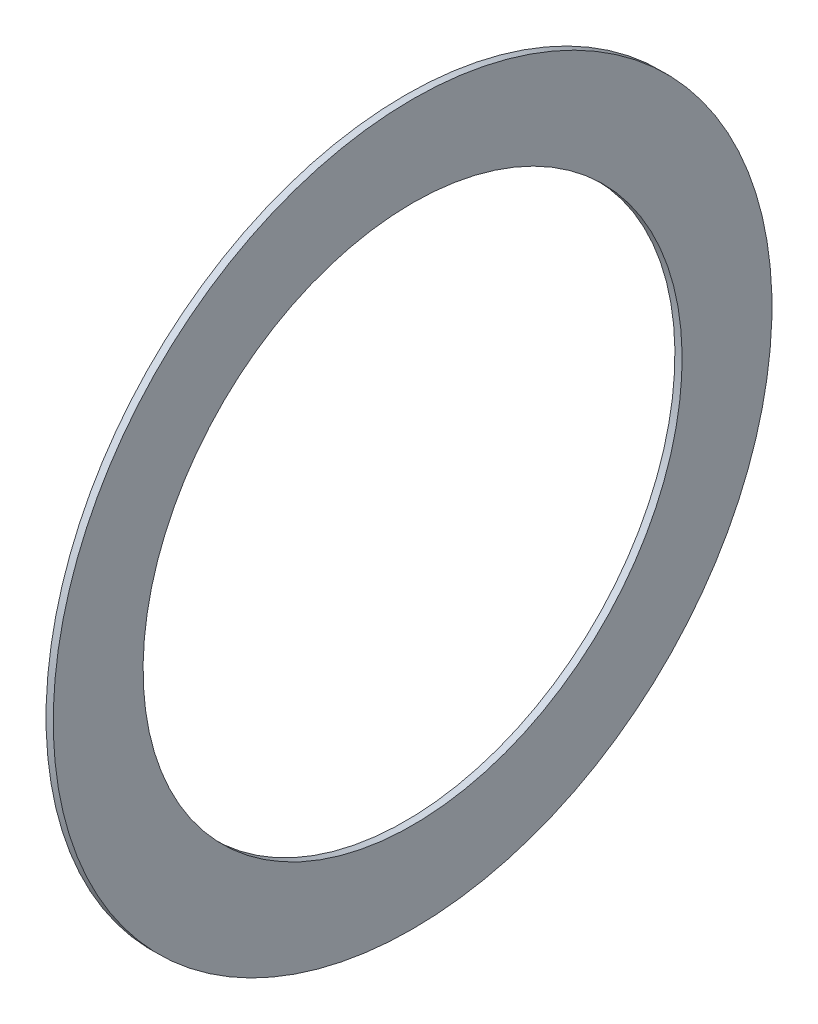
ISO-10303-21;
HEADER;
FILE_DESCRIPTION(('STEP AP214'),'2;1');
FILE_NAME('part.step','',(''),(''),'','','');
FILE_SCHEMA(('AUTOMOTIVE_DESIGN { 1 0 10303 214 1 1 1 1 }'));
ENDSEC;
DATA;
#1=APPLICATION_CONTEXT('core data for automotive mechanical design processes');
#2=APPLICATION_PROTOCOL_DEFINITION('international standard','automotive_design',2000,#1);
#3=PRODUCT_CONTEXT('',#1,'mechanical');
#4=PRODUCT('Part','Part','',(#3));
#5=PRODUCT_RELATED_PRODUCT_CATEGORY('part','',(#4));
#6=PRODUCT_DEFINITION_FORMATION('','',#4);
#7=PRODUCT_DEFINITION_CONTEXT('part definition',#1,'design');
#8=PRODUCT_DEFINITION('design','',#6,#7);
#9=PRODUCT_DEFINITION_SHAPE('','',#8);
#10=(LENGTH_UNIT() NAMED_UNIT(*) SI_UNIT(.MILLI.,.METRE.));
#11=(NAMED_UNIT(*) PLANE_ANGLE_UNIT() SI_UNIT($,.RADIAN.));
#12=(NAMED_UNIT(*) SI_UNIT($,.STERADIAN.) SOLID_ANGLE_UNIT());
#13=UNCERTAINTY_MEASURE_WITH_UNIT(LENGTH_MEASURE(1.E-05),#10,'distance_accuracy_value','');
#14=(GEOMETRIC_REPRESENTATION_CONTEXT(3) GLOBAL_UNCERTAINTY_ASSIGNED_CONTEXT((#13)) GLOBAL_UNIT_ASSIGNED_CONTEXT((#10,
#11,#12)) REPRESENTATION_CONTEXT('',''));
#15=CARTESIAN_POINT('',(0.,0.,0.));
#16=DIRECTION('',(0.,0.,1.));
#17=DIRECTION('',(1.,0.,0.));
#18=AXIS2_PLACEMENT_3D('',#15,#16,#17);
#19=CARTESIAN_POINT('',(0.5,0.,0.));
#20=DIRECTION('',(-1.,0.,0.));
#21=DIRECTION('',(0.,1.,0.));
#22=AXIS2_PLACEMENT_3D('',#19,#20,#21);
#23=CYLINDRICAL_SURFACE('',#22,50.);
#24=CARTESIAN_POINT('',(0.,0.,0.));
#25=DIRECTION('',(1.,0.,0.));
#26=DIRECTION('',(0.,1.,0.));
#27=AXIS2_PLACEMENT_3D('',#24,#25,#26);
#28=CIRCLE('',#27,50.);
#29=CARTESIAN_POINT('',(0.,50.,0.));
#30=VERTEX_POINT('',#29);
#31=EDGE_CURVE('E11',#30,#30,#28,.T.);
#32=ORIENTED_EDGE('',*,*,#31,.T.);
#33=EDGE_LOOP('',(#32));
#34=FACE_BOUND('',#33,.T.);
#35=CARTESIAN_POINT('',(1.,0.,0.));
#36=DIRECTION('',(1.,0.,0.));
#37=DIRECTION('',(0.,1.,0.));
#38=AXIS2_PLACEMENT_3D('',#35,#36,#37);
#39=CIRCLE('',#38,50.);
#40=CARTESIAN_POINT('',(1.,50.,0.));
#41=VERTEX_POINT('',#40);
#42=EDGE_CURVE('E38',#41,#41,#39,.T.);
#43=ORIENTED_EDGE('',*,*,#42,.F.);
#44=EDGE_LOOP('',(#43));
#45=FACE_BOUND('',#44,.T.);
#46=ADVANCED_FACE('F17',(#34,#45),#23,.T.);
#47=CARTESIAN_POINT('',(0.,43.75,0.));
#48=DIRECTION('',(-1.,0.,0.));
#49=DIRECTION('',(0.,-1.,0.));
#50=AXIS2_PLACEMENT_3D('',#47,#48,#49);
#51=PLANE('',#50);
#52=CARTESIAN_POINT('',(0.,0.,0.));
#53=DIRECTION('',(1.,0.,0.));
#54=DIRECTION('',(0.,1.,0.));
#55=AXIS2_PLACEMENT_3D('',#52,#53,#54);
#56=CIRCLE('',#55,37.5);
#57=CARTESIAN_POINT('',(0.,37.5,0.));
#58=VERTEX_POINT('',#57);
#59=EDGE_CURVE('E27',#58,#58,#56,.T.);
#60=ORIENTED_EDGE('',*,*,#59,.T.);
#61=EDGE_LOOP('',(#60));
#62=FACE_BOUND('',#61,.T.);
#63=ORIENTED_EDGE('',*,*,#31,.F.);
#64=EDGE_LOOP('',(#63));
#65=FACE_BOUND('',#64,.T.);
#66=ADVANCED_FACE('F54',(#62,#65),#51,.T.);
#67=CARTESIAN_POINT('',(0.5,0.,0.));
#68=DIRECTION('',(-1.,0.,0.));
#69=DIRECTION('',(0.,1.,0.));
#70=AXIS2_PLACEMENT_3D('',#67,#68,#69);
#71=CYLINDRICAL_SURFACE('',#70,37.5);
#72=CARTESIAN_POINT('',(1.,0.,0.));
#73=DIRECTION('',(1.,0.,0.));
#74=DIRECTION('',(0.,1.,0.));
#75=AXIS2_PLACEMENT_3D('',#72,#73,#74);
#76=CIRCLE('',#75,37.5);
#77=CARTESIAN_POINT('',(1.,37.5,0.));
#78=VERTEX_POINT('',#77);
#79=EDGE_CURVE('E42',#78,#78,#76,.T.);
#80=ORIENTED_EDGE('',*,*,#79,.T.);
#81=EDGE_LOOP('',(#80));
#82=FACE_BOUND('',#81,.T.);
#83=ORIENTED_EDGE('',*,*,#59,.F.);
#84=EDGE_LOOP('',(#83));
#85=FACE_BOUND('',#84,.T.);
#86=ADVANCED_FACE('F43',(#82,#85),#71,.F.);
#87=CARTESIAN_POINT('',(1.,43.75,0.));
#88=DIRECTION('',(1.,0.,0.));
#89=DIRECTION('',(0.,1.,0.));
#90=AXIS2_PLACEMENT_3D('',#87,#88,#89);
#91=PLANE('',#90);
#92=ORIENTED_EDGE('',*,*,#42,.T.);
#93=EDGE_LOOP('',(#92));
#94=FACE_BOUND('',#93,.T.);
#95=ORIENTED_EDGE('',*,*,#79,.F.);
#96=EDGE_LOOP('',(#95));
#97=FACE_BOUND('',#96,.T.);
#98=ADVANCED_FACE('F19',(#94,#97),#91,.T.);
#99=CLOSED_SHELL('',(#46,#66,#86,#98));
#100=MANIFOLD_SOLID_BREP('B1',#99);
#101=ADVANCED_BREP_SHAPE_REPRESENTATION('',(#18,#100),#14);
#102=SHAPE_DEFINITION_REPRESENTATION(#9,#101);
ENDSEC;
END-ISO-10303-21;
